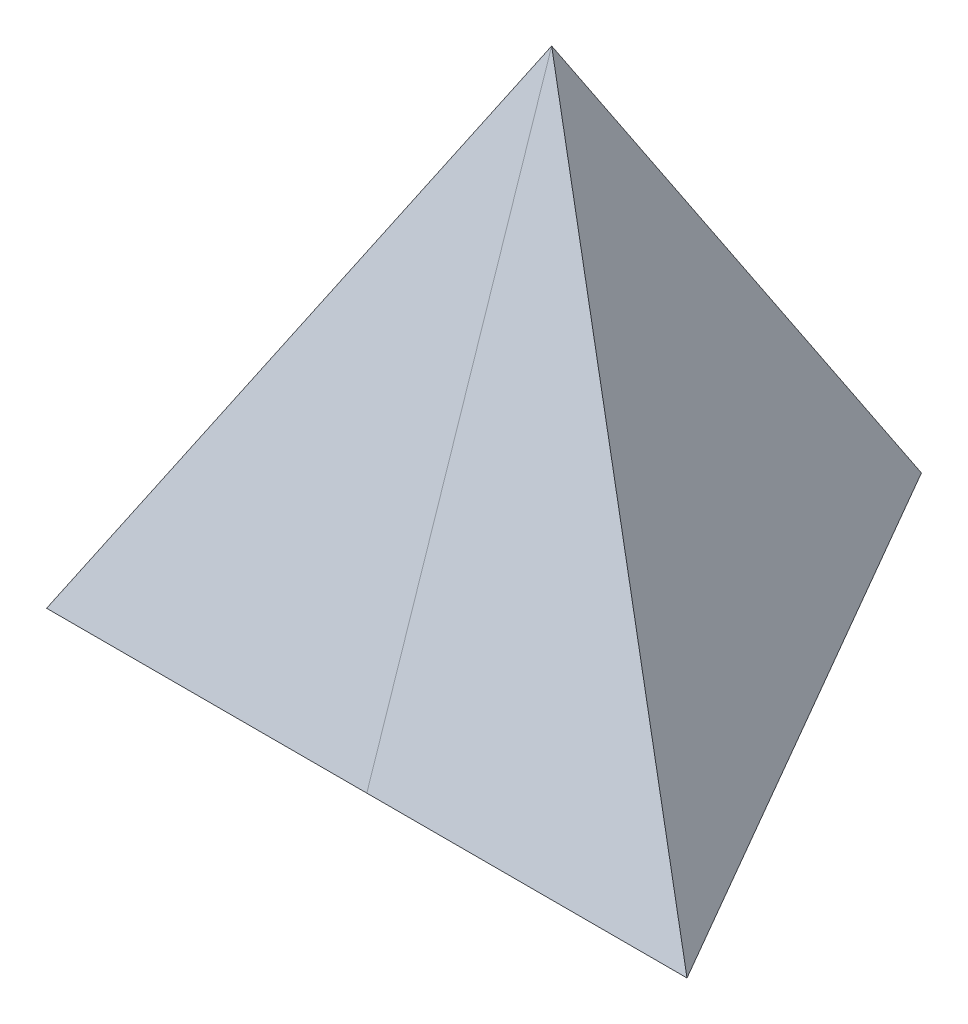
ISO-10303-21;
HEADER;
FILE_DESCRIPTION(('STEP AP214'),'2;1');
FILE_NAME('part.step','',(''),(''),'','','');
FILE_SCHEMA(('AUTOMOTIVE_DESIGN { 1 0 10303 214 1 1 1 1 }'));
ENDSEC;
DATA;
#1=APPLICATION_CONTEXT('core data for automotive mechanical design processes');
#2=APPLICATION_PROTOCOL_DEFINITION('international standard','automotive_design',2000,#1);
#3=PRODUCT_CONTEXT('',#1,'mechanical');
#4=PRODUCT('Part','Part','',(#3));
#5=PRODUCT_RELATED_PRODUCT_CATEGORY('part','',(#4));
#6=PRODUCT_DEFINITION_FORMATION('','',#4);
#7=PRODUCT_DEFINITION_CONTEXT('part definition',#1,'design');
#8=PRODUCT_DEFINITION('design','',#6,#7);
#9=PRODUCT_DEFINITION_SHAPE('','',#8);
#10=(LENGTH_UNIT() NAMED_UNIT(*) SI_UNIT(.MILLI.,.METRE.));
#11=(NAMED_UNIT(*) PLANE_ANGLE_UNIT() SI_UNIT($,.RADIAN.));
#12=(NAMED_UNIT(*) SI_UNIT($,.STERADIAN.) SOLID_ANGLE_UNIT());
#13=UNCERTAINTY_MEASURE_WITH_UNIT(LENGTH_MEASURE(1.E-05),#10,'distance_accuracy_value','');
#14=(GEOMETRIC_REPRESENTATION_CONTEXT(3) GLOBAL_UNCERTAINTY_ASSIGNED_CONTEXT((#13)) GLOBAL_UNIT_ASSIGNED_CONTEXT((#10,
#11,#12)) REPRESENTATION_CONTEXT('',''));
#15=CARTESIAN_POINT('',(0.,0.,0.));
#16=DIRECTION('',(0.,0.,1.));
#17=DIRECTION('',(1.,0.,0.));
#18=AXIS2_PLACEMENT_3D('',#15,#16,#17);
#19=CARTESIAN_POINT('',(0.,0.,0.));
#20=DIRECTION('',(0.,-1.,0.));
#21=DIRECTION('',(0.,0.,-1.));
#22=AXIS2_PLACEMENT_3D('',#19,#20,#21);
#23=PLANE('',#22);
#24=DIRECTION('',(1.,0.,0.));
#25=VECTOR('',#24,1.);
#26=CARTESIAN_POINT('',(0.,0.,16.9333333333332));
#27=LINE('',#26,#25);
#28=CARTESIAN_POINT('',(0.,0.,16.9333333333332));
#29=VERTEX_POINT('',#28);
#30=CARTESIAN_POINT('',(29.3293936748328,0.,16.9333333333332));
#31=VERTEX_POINT('',#30);
#32=EDGE_CURVE('E90',#29,#31,#27,.T.);
#33=ORIENTED_EDGE('',*,*,#32,.F.);
#34=DIRECTION('',(0.,0.,1.));
#35=VECTOR('',#34,1.);
#36=CARTESIAN_POINT('',(0.,0.,-33.8666666666664));
#37=LINE('',#36,#35);
#38=CARTESIAN_POINT('',(0.,0.,-33.8666666666664));
#39=VERTEX_POINT('',#38);
#40=EDGE_CURVE('E13',#39,#29,#37,.T.);
#41=ORIENTED_EDGE('',*,*,#40,.F.);
#42=DIRECTION('',(-0.5,0.,-0.866025403784438));
#43=VECTOR('',#42,1.);
#44=CARTESIAN_POINT('',(29.3293936748328,0.,16.9333333333332));
#45=LINE('',#44,#43);
#46=EDGE_CURVE('E64',#31,#39,#45,.T.);
#47=ORIENTED_EDGE('',*,*,#46,.F.);
#48=EDGE_LOOP('',(#33,#41,#47));
#49=FACE_BOUND('',#48,.T.);
#50=ADVANCED_FACE('F51',(#49),#23,.T.);
#51=CARTESIAN_POINT('',(0.,0.,0.));
#52=DIRECTION('',(1.,0.,0.));
#53=DIRECTION('',(0.,0.,-1.));
#54=AXIS2_PLACEMENT_3D('',#51,#52,#53);
#55=PLANE('',#54);
#56=DIRECTION('',(0.,0.948683298050514,-0.316227766016836));
#57=VECTOR('',#56,1.);
#58=CARTESIAN_POINT('',(0.,0.,16.9333333333332));
#59=LINE('',#58,#57);
#60=CARTESIAN_POINT('',(0.,50.8,0.));
#61=VERTEX_POINT('',#60);
#62=EDGE_CURVE('E91',#29,#61,#59,.T.);
#63=ORIENTED_EDGE('',*,*,#62,.T.);
#64=DIRECTION('',(0.,0.832050294337845,0.554700196225226));
#65=VECTOR('',#64,1.);
#66=CARTESIAN_POINT('',(0.,0.,-33.8666666666664));
#67=LINE('',#66,#65);
#68=EDGE_CURVE('E83',#39,#61,#67,.T.);
#69=ORIENTED_EDGE('',*,*,#68,.F.);
#70=ORIENTED_EDGE('',*,*,#40,.T.);
#71=EDGE_LOOP('',(#63,#69,#70));
#72=FACE_BOUND('',#71,.T.);
#73=ADVANCED_FACE('F93',(#72),#55,.F.);
#74=CARTESIAN_POINT('',(13.1982271536748,5.07999999999994,-7.61999999999996));
#75=DIRECTION('',(-0.82158383625775,-0.316227766016836,0.474341649025258));
#76=DIRECTION('',(0.5,0.,0.866025403784438));
#77=AXIS2_PLACEMENT_3D('',#74,#75,#76);
#78=PLANE('',#77);
#79=ORIENTED_EDGE('',*,*,#68,.T.);
#80=DIRECTION('',(-0.480384461415259,0.832050294337845,-0.277350098112613));
#81=VECTOR('',#80,1.);
#82=CARTESIAN_POINT('',(29.3293936748328,0.,16.9333333333332));
#83=LINE('',#82,#81);
#84=EDGE_CURVE('E87',#31,#61,#83,.T.);
#85=ORIENTED_EDGE('',*,*,#84,.F.);
#86=ORIENTED_EDGE('',*,*,#46,.T.);
#87=EDGE_LOOP('',(#79,#85,#86));
#88=FACE_BOUND('',#87,.T.);
#89=ADVANCED_FACE('F85',(#88),#78,.F.);
#90=CARTESIAN_POINT('',(0.,5.07999999999995,15.2399999999999));
#91=DIRECTION('',(0.,-0.316227766016836,-0.948683298050514));
#92=DIRECTION('',(0.,0.948683298050514,-0.316227766016836));
#93=AXIS2_PLACEMENT_3D('',#90,#91,#92);
#94=PLANE('',#93);
#95=ORIENTED_EDGE('',*,*,#84,.T.);
#96=ORIENTED_EDGE('',*,*,#62,.F.);
#97=ORIENTED_EDGE('',*,*,#32,.T.);
#98=EDGE_LOOP('',(#95,#96,#97));
#99=FACE_BOUND('',#98,.T.);
#100=ADVANCED_FACE('F53',(#99),#94,.F.);
#101=CLOSED_SHELL('',(#50,#73,#89,#100));
#102=MANIFOLD_SOLID_BREP('B2',#101);
#103=CARTESIAN_POINT('',(0.,0.,0.));
#104=DIRECTION('',(0.,1.,0.));
#105=DIRECTION('',(0.,0.,1.));
#106=AXIS2_PLACEMENT_3D('',#103,#104,#105);
#107=PLANE('',#106);
#108=DIRECTION('',(-0.5,0.,0.866025403784439));
#109=VECTOR('',#108,1.);
#110=CARTESIAN_POINT('',(0.,0.,-33.8666666666666));
#111=LINE('',#110,#109);
#112=CARTESIAN_POINT('',(0.,0.,-33.8666666666666));
#113=VERTEX_POINT('',#112);
#114=CARTESIAN_POINT('',(-29.3293936748329,0.,16.9333333333332));
#115=VERTEX_POINT('',#114);
#116=EDGE_CURVE('E235',#113,#115,#111,.T.);
#117=ORIENTED_EDGE('',*,*,#116,.F.);
#118=DIRECTION('',(0.,0.,-1.));
#119=VECTOR('',#118,1.);
#120=CARTESIAN_POINT('',(0.,0.,-33.8666666666666));
#121=LINE('',#120,#119);
#122=CARTESIAN_POINT('',(0.,0.,16.9333333333332));
#123=VERTEX_POINT('',#122);
#124=EDGE_CURVE('E49',#123,#113,#121,.T.);
#125=ORIENTED_EDGE('',*,*,#124,.F.);
#126=DIRECTION('',(1.,0.,0.));
#127=VECTOR('',#126,1.);
#128=CARTESIAN_POINT('',(-29.3293936748329,0.,16.9333333333332));
#129=LINE('',#128,#127);
#130=EDGE_CURVE('E208',#115,#123,#129,.T.);
#131=ORIENTED_EDGE('',*,*,#130,.F.);
#132=EDGE_LOOP('',(#117,#125,#131));
#133=FACE_BOUND('',#132,.T.);
#134=ADVANCED_FACE('F195',(#133),#107,.F.);
#135=CARTESIAN_POINT('',(0.,0.,0.));
#136=DIRECTION('',(-1.,0.,0.));
#137=DIRECTION('',(0.,0.,1.));
#138=AXIS2_PLACEMENT_3D('',#135,#136,#137);
#139=PLANE('',#138);
#140=DIRECTION('',(0.,0.832050294337844,0.554700196225228));
#141=VECTOR('',#140,1.);
#142=CARTESIAN_POINT('',(0.,0.,-33.8666666666666));
#143=LINE('',#142,#141);
#144=CARTESIAN_POINT('',(0.,50.8,0.));
#145=VERTEX_POINT('',#144);
#146=EDGE_CURVE('E225',#113,#145,#143,.T.);
#147=ORIENTED_EDGE('',*,*,#146,.T.);
#148=DIRECTION('',(0.,0.948683298050514,-0.316227766016836));
#149=VECTOR('',#148,1.);
#150=CARTESIAN_POINT('',(0.,0.,16.9333333333332));
#151=LINE('',#150,#149);
#152=EDGE_CURVE('E230',#123,#145,#151,.T.);
#153=ORIENTED_EDGE('',*,*,#152,.F.);
#154=ORIENTED_EDGE('',*,*,#124,.T.);
#155=EDGE_LOOP('',(#147,#153,#154));
#156=FACE_BOUND('',#155,.T.);
#157=ADVANCED_FACE('F237',(#156),#139,.F.);
#158=CARTESIAN_POINT('',(0.,5.07999999999995,15.2399999999999));
#159=DIRECTION('',(0.,-0.316227766016836,-0.948683298050514));
#160=DIRECTION('',(0.,0.948683298050514,-0.316227766016836));
#161=AXIS2_PLACEMENT_3D('',#158,#159,#160);
#162=PLANE('',#161);
#163=ORIENTED_EDGE('',*,*,#152,.T.);
#164=DIRECTION('',(0.48038446141526,0.832050294337845,-0.277350098112613));
#165=VECTOR('',#164,1.);
#166=CARTESIAN_POINT('',(-29.3293936748329,0.,16.9333333333332));
#167=LINE('',#166,#165);
#168=EDGE_CURVE('E232',#115,#145,#167,.T.);
#169=ORIENTED_EDGE('',*,*,#168,.F.);
#170=ORIENTED_EDGE('',*,*,#130,.T.);
#171=EDGE_LOOP('',(#163,#169,#170));
#172=FACE_BOUND('',#171,.T.);
#173=ADVANCED_FACE('F231',(#172),#162,.F.);
#174=CARTESIAN_POINT('',(-13.1982271536748,5.07999999999998,-7.61999999999999));
#175=DIRECTION('',(0.821583836257749,-0.316227766016837,0.474341649025257));
#176=DIRECTION('',(0.5,0.,-0.866025403784439));
#177=AXIS2_PLACEMENT_3D('',#174,#175,#176);
#178=PLANE('',#177);
#179=ORIENTED_EDGE('',*,*,#168,.T.);
#180=ORIENTED_EDGE('',*,*,#146,.F.);
#181=ORIENTED_EDGE('',*,*,#116,.T.);
#182=EDGE_LOOP('',(#179,#180,#181));
#183=FACE_BOUND('',#182,.T.);
#184=ADVANCED_FACE('F197',(#183),#178,.F.);
#185=CLOSED_SHELL('',(#134,#157,#173,#184));
#186=MANIFOLD_SOLID_BREP('B7',#185);
#187=ADVANCED_BREP_SHAPE_REPRESENTATION('',(#18,#102,#186),#14);
#188=SHAPE_DEFINITION_REPRESENTATION(#9,#187);
ENDSEC;
END-ISO-10303-21;
